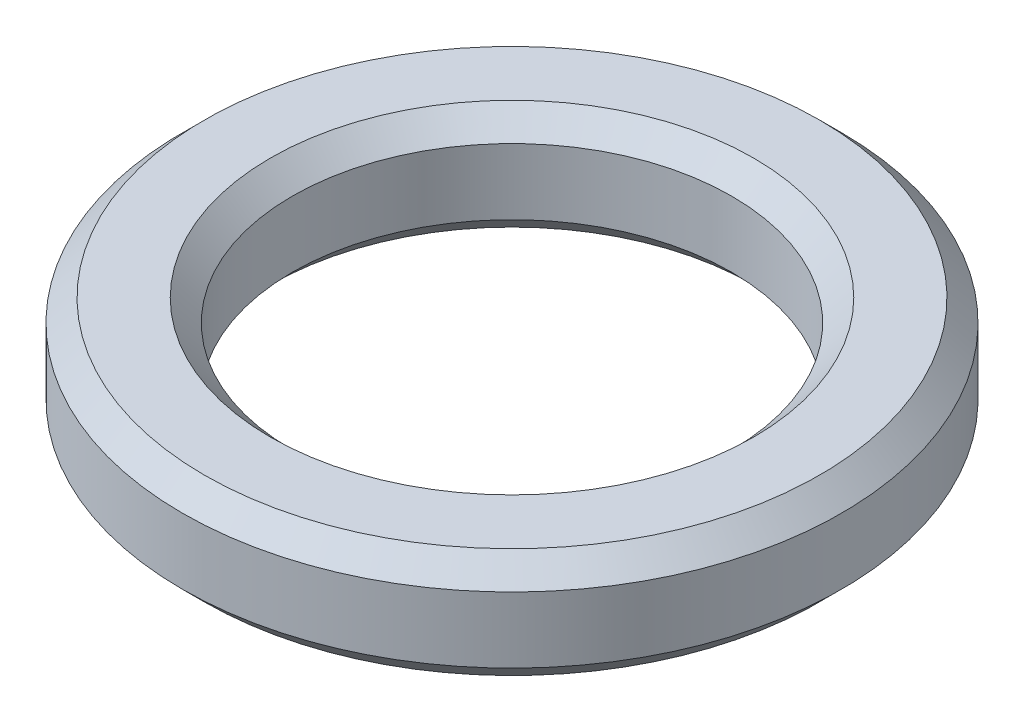
ISO-10303-21;
HEADER;
FILE_DESCRIPTION(('STEP AP214'),'2;1');
FILE_NAME('part.step','',(''),(''),'','','');
FILE_SCHEMA(('AUTOMOTIVE_DESIGN { 1 0 10303 214 1 1 1 1 }'));
ENDSEC;
DATA;
#1=APPLICATION_CONTEXT('core data for automotive mechanical design processes');
#2=APPLICATION_PROTOCOL_DEFINITION('international standard','automotive_design',2000,#1);
#3=PRODUCT_CONTEXT('',#1,'mechanical');
#4=PRODUCT('Part','Part','',(#3));
#5=PRODUCT_RELATED_PRODUCT_CATEGORY('part','',(#4));
#6=PRODUCT_DEFINITION_FORMATION('','',#4);
#7=PRODUCT_DEFINITION_CONTEXT('part definition',#1,'design');
#8=PRODUCT_DEFINITION('design','',#6,#7);
#9=PRODUCT_DEFINITION_SHAPE('','',#8);
#10=(LENGTH_UNIT() NAMED_UNIT(*) SI_UNIT(.MILLI.,.METRE.));
#11=(NAMED_UNIT(*) PLANE_ANGLE_UNIT() SI_UNIT($,.RADIAN.));
#12=(NAMED_UNIT(*) SI_UNIT($,.STERADIAN.) SOLID_ANGLE_UNIT());
#13=UNCERTAINTY_MEASURE_WITH_UNIT(LENGTH_MEASURE(1.E-05),#10,'distance_accuracy_value','');
#14=(GEOMETRIC_REPRESENTATION_CONTEXT(3) GLOBAL_UNCERTAINTY_ASSIGNED_CONTEXT((#13)) GLOBAL_UNIT_ASSIGNED_CONTEXT((#10,
#11,#12)) REPRESENTATION_CONTEXT('',''));
#15=CARTESIAN_POINT('',(0.,0.,0.));
#16=DIRECTION('',(0.,0.,1.));
#17=DIRECTION('',(1.,0.,0.));
#18=AXIS2_PLACEMENT_3D('',#15,#16,#17);
#19=CARTESIAN_POINT('',(0.,5.,0.));
#20=DIRECTION('',(0.,1.,0.));
#21=DIRECTION('',(0.,0.,1.));
#22=AXIS2_PLACEMENT_3D('',#19,#20,#21);
#23=PLANE('',#22);
#24=CARTESIAN_POINT('',(0.,5.,0.));
#25=DIRECTION('',(0.,1.,0.));
#26=DIRECTION('',(0.,0.,1.));
#27=AXIS2_PLACEMENT_3D('',#24,#25,#26);
#28=CIRCLE('',#27,14.);
#29=CARTESIAN_POINT('',(0.,5.,14.));
#30=VERTEX_POINT('',#29);
#31=EDGE_CURVE('E57',#30,#30,#28,.T.);
#32=ORIENTED_EDGE('',*,*,#31,.T.);
#33=EDGE_LOOP('',(#32));
#34=FACE_BOUND('',#33,.T.);
#35=CARTESIAN_POINT('',(0.,5.,0.));
#36=DIRECTION('',(0.,1.,0.));
#37=DIRECTION('',(0.,0.,1.));
#38=AXIS2_PLACEMENT_3D('',#35,#36,#37);
#39=CIRCLE('',#38,11.);
#40=CARTESIAN_POINT('',(0.,5.,11.));
#41=VERTEX_POINT('',#40);
#42=EDGE_CURVE('E62',#41,#41,#39,.F.);
#43=ORIENTED_EDGE('',*,*,#42,.T.);
#44=EDGE_LOOP('',(#43));
#45=FACE_BOUND('',#44,.T.);
#46=ADVANCED_FACE('F44',(#34,#45),#23,.T.);
#47=CARTESIAN_POINT('',(0.,0.,0.));
#48=DIRECTION('',(0.,1.,0.));
#49=DIRECTION('',(0.,0.,1.));
#50=AXIS2_PLACEMENT_3D('',#47,#48,#49);
#51=PLANE('',#50);
#52=CARTESIAN_POINT('',(0.,0.,0.));
#53=DIRECTION('',(0.,1.,0.));
#54=DIRECTION('',(0.,0.,1.));
#55=AXIS2_PLACEMENT_3D('',#52,#53,#54);
#56=CIRCLE('',#55,14.);
#57=CARTESIAN_POINT('',(0.,0.,14.));
#58=VERTEX_POINT('',#57);
#59=EDGE_CURVE('E68',#58,#58,#56,.F.);
#60=ORIENTED_EDGE('',*,*,#59,.T.);
#61=EDGE_LOOP('',(#60));
#62=FACE_BOUND('',#61,.T.);
#63=CARTESIAN_POINT('',(0.,0.,0.));
#64=DIRECTION('',(0.,1.,0.));
#65=DIRECTION('',(0.,0.,1.));
#66=AXIS2_PLACEMENT_3D('',#63,#64,#65);
#67=CIRCLE('',#66,11.);
#68=CARTESIAN_POINT('',(0.,0.,11.));
#69=VERTEX_POINT('',#68);
#70=EDGE_CURVE('E72',#69,#69,#67,.T.);
#71=ORIENTED_EDGE('',*,*,#70,.T.);
#72=EDGE_LOOP('',(#71));
#73=FACE_BOUND('',#72,.T.);
#74=ADVANCED_FACE('F97',(#62,#73),#51,.F.);
#75=CARTESIAN_POINT('',(0.,5.,0.));
#76=DIRECTION('',(0.,-1.,0.));
#77=DIRECTION('',(0.,0.,-1.));
#78=AXIS2_PLACEMENT_3D('',#75,#76,#77);
#79=CYLINDRICAL_SURFACE('',#78,15.);
#80=CARTESIAN_POINT('',(0.,0.999999999999996,0.));
#81=DIRECTION('',(0.,1.,0.));
#82=DIRECTION('',(0.,0.,1.));
#83=AXIS2_PLACEMENT_3D('',#80,#81,#82);
#84=CIRCLE('',#83,15.);
#85=CARTESIAN_POINT('',(0.,0.999999999999996,15.));
#86=VERTEX_POINT('',#85);
#87=EDGE_CURVE('E76',#86,#86,#84,.T.);
#88=ORIENTED_EDGE('',*,*,#87,.T.);
#89=EDGE_LOOP('',(#88));
#90=FACE_BOUND('',#89,.T.);
#91=CARTESIAN_POINT('',(0.,4.,0.));
#92=DIRECTION('',(0.,1.,0.));
#93=DIRECTION('',(0.,0.,1.));
#94=AXIS2_PLACEMENT_3D('',#91,#92,#93);
#95=CIRCLE('',#94,15.);
#96=CARTESIAN_POINT('',(0.,4.,15.));
#97=VERTEX_POINT('',#96);
#98=EDGE_CURVE('E80',#97,#97,#95,.F.);
#99=ORIENTED_EDGE('',*,*,#98,.T.);
#100=EDGE_LOOP('',(#99));
#101=FACE_BOUND('',#100,.T.);
#102=ADVANCED_FACE('F85',(#90,#101),#79,.T.);
#103=CARTESIAN_POINT('',(0.,5.,0.));
#104=DIRECTION('',(0.,-1.,0.));
#105=DIRECTION('',(0.,0.,-1.));
#106=AXIS2_PLACEMENT_3D('',#103,#104,#105);
#107=CYLINDRICAL_SURFACE('',#106,10.);
#108=CARTESIAN_POINT('',(0.,1.,0.));
#109=DIRECTION('',(0.,1.,0.));
#110=DIRECTION('',(0.,0.,1.));
#111=AXIS2_PLACEMENT_3D('',#108,#109,#110);
#112=CIRCLE('',#111,10.);
#113=CARTESIAN_POINT('',(0.,1.,10.));
#114=VERTEX_POINT('',#113);
#115=EDGE_CURVE('E11',#114,#114,#112,.F.);
#116=ORIENTED_EDGE('',*,*,#115,.T.);
#117=EDGE_LOOP('',(#116));
#118=FACE_BOUND('',#117,.T.);
#119=CARTESIAN_POINT('',(0.,4.,0.));
#120=DIRECTION('',(0.,1.,0.));
#121=DIRECTION('',(0.,0.,1.));
#122=AXIS2_PLACEMENT_3D('',#119,#120,#121);
#123=CIRCLE('',#122,10.);
#124=CARTESIAN_POINT('',(0.,4.,10.));
#125=VERTEX_POINT('',#124);
#126=EDGE_CURVE('E52',#125,#125,#123,.T.);
#127=ORIENTED_EDGE('',*,*,#126,.T.);
#128=EDGE_LOOP('',(#127));
#129=FACE_BOUND('',#128,.T.);
#130=ADVANCED_FACE('F113',(#118,#129),#107,.F.);
#131=CARTESIAN_POINT('',(0.,0.999999999999996,0.));
#132=DIRECTION('',(0.,1.,0.));
#133=DIRECTION('',(0.,0.,1.));
#134=AXIS2_PLACEMENT_3D('',#131,#132,#133);
#135=CONICAL_SURFACE('',#134,15.,0.78539816339745);
#136=ORIENTED_EDGE('',*,*,#59,.F.);
#137=EDGE_LOOP('',(#136));
#138=FACE_BOUND('',#137,.T.);
#139=ORIENTED_EDGE('',*,*,#87,.F.);
#140=EDGE_LOOP('',(#139));
#141=FACE_BOUND('',#140,.T.);
#142=ADVANCED_FACE('F91',(#138,#141),#135,.T.);
#143=CARTESIAN_POINT('',(0.,5.,0.));
#144=DIRECTION('',(0.,-1.,0.));
#145=DIRECTION('',(0.,0.,-1.));
#146=AXIS2_PLACEMENT_3D('',#143,#144,#145);
#147=CONICAL_SURFACE('',#146,14.,0.785398163397446);
#148=ORIENTED_EDGE('',*,*,#98,.F.);
#149=EDGE_LOOP('',(#148));
#150=FACE_BOUND('',#149,.T.);
#151=ORIENTED_EDGE('',*,*,#31,.F.);
#152=EDGE_LOOP('',(#151));
#153=FACE_BOUND('',#152,.T.);
#154=ADVANCED_FACE('F87',(#150,#153),#147,.T.);
#155=CARTESIAN_POINT('',(0.,0.,0.));
#156=DIRECTION('',(0.,-1.,0.));
#157=DIRECTION('',(0.,0.,-1.));
#158=AXIS2_PLACEMENT_3D('',#155,#156,#157);
#159=CONICAL_SURFACE('',#158,11.,0.785398163397447);
#160=ORIENTED_EDGE('',*,*,#115,.F.);
#161=EDGE_LOOP('',(#160));
#162=FACE_BOUND('',#161,.T.);
#163=ORIENTED_EDGE('',*,*,#70,.F.);
#164=EDGE_LOOP('',(#163));
#165=FACE_BOUND('',#164,.T.);
#166=ADVANCED_FACE('F90',(#162,#165),#159,.F.);
#167=CARTESIAN_POINT('',(0.,4.,0.));
#168=DIRECTION('',(0.,1.,0.));
#169=DIRECTION('',(0.,0.,1.));
#170=AXIS2_PLACEMENT_3D('',#167,#168,#169);
#171=CONICAL_SURFACE('',#170,10.,0.785398163397448);
#172=ORIENTED_EDGE('',*,*,#42,.F.);
#173=EDGE_LOOP('',(#172));
#174=FACE_BOUND('',#173,.T.);
#175=ORIENTED_EDGE('',*,*,#126,.F.);
#176=EDGE_LOOP('',(#175));
#177=FACE_BOUND('',#176,.T.);
#178=ADVANCED_FACE('F46',(#174,#177),#171,.F.);
#179=CLOSED_SHELL('',(#46,#74,#102,#130,#142,#154,#166,#178));
#180=MANIFOLD_SOLID_BREP('B2',#179);
#181=ADVANCED_BREP_SHAPE_REPRESENTATION('',(#18,#180),#14);
#182=SHAPE_DEFINITION_REPRESENTATION(#9,#181);
ENDSEC;
END-ISO-10303-21;
